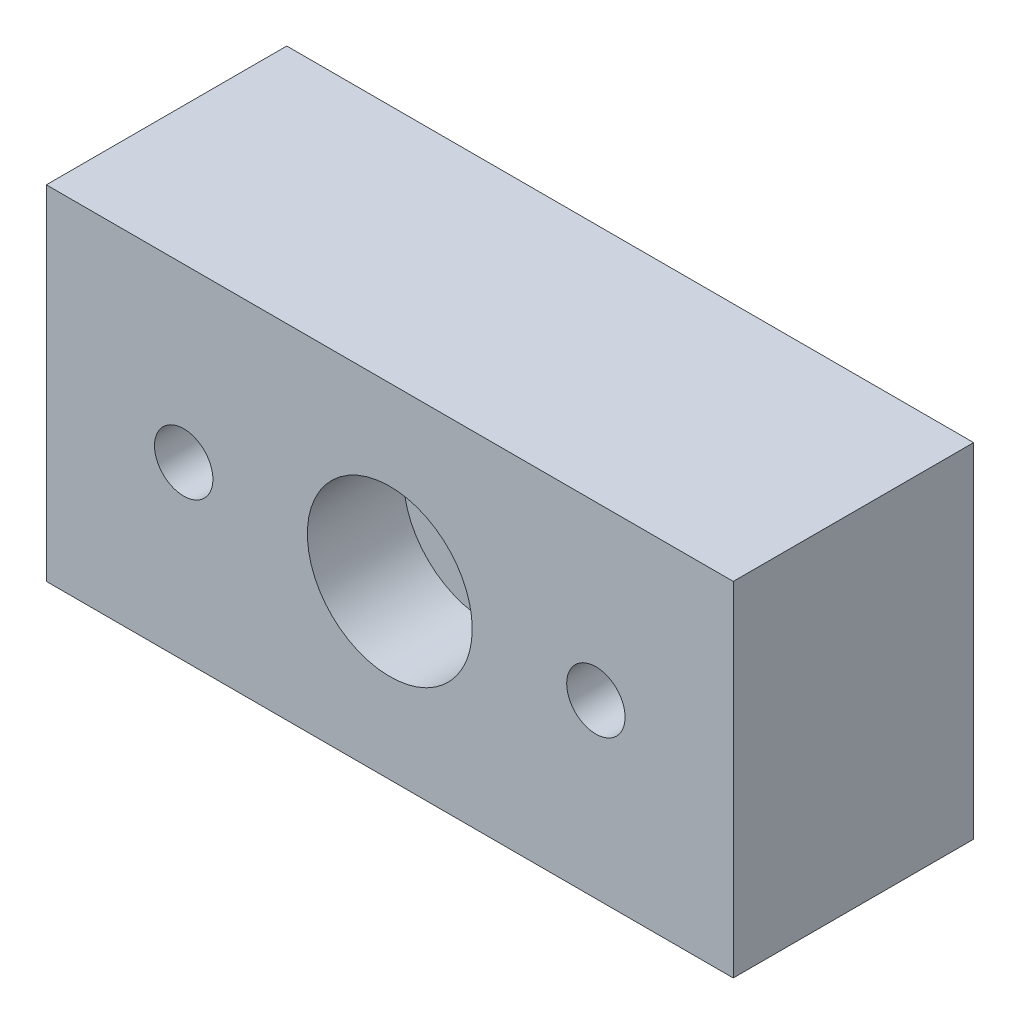
ISO-10303-21;
HEADER;
FILE_DESCRIPTION(('STEP AP214'),'2;1');
FILE_NAME('part.step','',(''),(''),'','','');
FILE_SCHEMA(('AUTOMOTIVE_DESIGN { 1 0 10303 214 1 1 1 1 }'));
ENDSEC;
DATA;
#1=APPLICATION_CONTEXT('core data for automotive mechanical design processes');
#2=APPLICATION_PROTOCOL_DEFINITION('international standard','automotive_design',2000,#1);
#3=PRODUCT_CONTEXT('',#1,'mechanical');
#4=PRODUCT('Part','Part','',(#3));
#5=PRODUCT_RELATED_PRODUCT_CATEGORY('part','',(#4));
#6=PRODUCT_DEFINITION_FORMATION('','',#4);
#7=PRODUCT_DEFINITION_CONTEXT('part definition',#1,'design');
#8=PRODUCT_DEFINITION('design','',#6,#7);
#9=PRODUCT_DEFINITION_SHAPE('','',#8);
#10=(LENGTH_UNIT() NAMED_UNIT(*) SI_UNIT(.MILLI.,.METRE.));
#11=(NAMED_UNIT(*) PLANE_ANGLE_UNIT() SI_UNIT($,.RADIAN.));
#12=(NAMED_UNIT(*) SI_UNIT($,.STERADIAN.) SOLID_ANGLE_UNIT());
#13=UNCERTAINTY_MEASURE_WITH_UNIT(LENGTH_MEASURE(1.E-05),#10,'distance_accuracy_value','');
#14=(GEOMETRIC_REPRESENTATION_CONTEXT(3) GLOBAL_UNCERTAINTY_ASSIGNED_CONTEXT((#13)) GLOBAL_UNIT_ASSIGNED_CONTEXT((#10,
#11,#12)) REPRESENTATION_CONTEXT('',''));
#15=CARTESIAN_POINT('',(0.,0.,0.));
#16=DIRECTION('',(0.,0.,1.));
#17=DIRECTION('',(1.,0.,0.));
#18=AXIS2_PLACEMENT_3D('',#15,#16,#17);
#19=CARTESIAN_POINT('',(50.,-25.,35.));
#20=DIRECTION('',(-1.,0.,0.));
#21=DIRECTION('',(0.,0.,1.));
#22=AXIS2_PLACEMENT_3D('',#19,#20,#21);
#23=PLANE('',#22);
#24=DIRECTION('',(0.,1.,0.));
#25=VECTOR('',#24,1.);
#26=CARTESIAN_POINT('',(50.,-25.,0.));
#27=LINE('',#26,#25);
#28=CARTESIAN_POINT('',(50.,-25.,0.));
#29=VERTEX_POINT('',#28);
#30=CARTESIAN_POINT('',(50.,25.,0.));
#31=VERTEX_POINT('',#30);
#32=EDGE_CURVE('E259',#29,#31,#27,.T.);
#33=ORIENTED_EDGE('',*,*,#32,.T.);
#34=DIRECTION('',(0.,0.,-1.));
#35=VECTOR('',#34,1.);
#36=CARTESIAN_POINT('',(50.,25.,35.));
#37=LINE('',#36,#35);
#38=CARTESIAN_POINT('',(50.,25.,35.));
#39=VERTEX_POINT('',#38);
#40=EDGE_CURVE('E11',#39,#31,#37,.T.);
#41=ORIENTED_EDGE('',*,*,#40,.F.);
#42=DIRECTION('',(0.,1.,0.));
#43=VECTOR('',#42,1.);
#44=CARTESIAN_POINT('',(50.,-25.,35.));
#45=LINE('',#44,#43);
#46=CARTESIAN_POINT('',(50.,-25.,35.));
#47=VERTEX_POINT('',#46);
#48=EDGE_CURVE('E260',#47,#39,#45,.T.);
#49=ORIENTED_EDGE('',*,*,#48,.F.);
#50=DIRECTION('',(0.,0.,-1.));
#51=VECTOR('',#50,1.);
#52=CARTESIAN_POINT('',(50.,-25.,35.));
#53=LINE('',#52,#51);
#54=EDGE_CURVE('E270',#47,#29,#53,.T.);
#55=ORIENTED_EDGE('',*,*,#54,.T.);
#56=EDGE_LOOP('',(#33,#41,#49,#55));
#57=FACE_BOUND('',#56,.T.);
#58=ADVANCED_FACE('F43',(#57),#23,.F.);
#59=CARTESIAN_POINT('',(-50.,25.,35.));
#60=DIRECTION('',(0.,-1.,0.));
#61=DIRECTION('',(0.,0.,-1.));
#62=AXIS2_PLACEMENT_3D('',#59,#60,#61);
#63=PLANE('',#62);
#64=DIRECTION('',(-1.,0.,0.));
#65=VECTOR('',#64,1.);
#66=CARTESIAN_POINT('',(-50.,25.,0.));
#67=LINE('',#66,#65);
#68=CARTESIAN_POINT('',(-50.,25.,0.));
#69=VERTEX_POINT('',#68);
#70=EDGE_CURVE('E274',#31,#69,#67,.T.);
#71=ORIENTED_EDGE('',*,*,#70,.T.);
#72=DIRECTION('',(0.,0.,-1.));
#73=VECTOR('',#72,1.);
#74=CARTESIAN_POINT('',(-50.,25.,35.));
#75=LINE('',#74,#73);
#76=CARTESIAN_POINT('',(-50.,25.,35.));
#77=VERTEX_POINT('',#76);
#78=EDGE_CURVE('E53',#77,#69,#75,.T.);
#79=ORIENTED_EDGE('',*,*,#78,.F.);
#80=DIRECTION('',(-1.,0.,0.));
#81=VECTOR('',#80,1.);
#82=CARTESIAN_POINT('',(-50.,25.,35.));
#83=LINE('',#82,#81);
#84=EDGE_CURVE('E93',#39,#77,#83,.T.);
#85=ORIENTED_EDGE('',*,*,#84,.F.);
#86=ORIENTED_EDGE('',*,*,#40,.T.);
#87=EDGE_LOOP('',(#71,#79,#85,#86));
#88=FACE_BOUND('',#87,.T.);
#89=ADVANCED_FACE('F312',(#88),#63,.F.);
#90=CARTESIAN_POINT('',(-50.,-25.,35.));
#91=DIRECTION('',(1.,0.,0.));
#92=DIRECTION('',(0.,0.,-1.));
#93=AXIS2_PLACEMENT_3D('',#90,#91,#92);
#94=PLANE('',#93);
#95=DIRECTION('',(0.,-1.,0.));
#96=VECTOR('',#95,1.);
#97=CARTESIAN_POINT('',(-50.,-25.,0.));
#98=LINE('',#97,#96);
#99=CARTESIAN_POINT('',(-50.,-25.,0.));
#100=VERTEX_POINT('',#99);
#101=EDGE_CURVE('E80',#69,#100,#98,.T.);
#102=ORIENTED_EDGE('',*,*,#101,.T.);
#103=DIRECTION('',(0.,0.,-1.));
#104=VECTOR('',#103,1.);
#105=CARTESIAN_POINT('',(-50.,-25.,35.));
#106=LINE('',#105,#104);
#107=CARTESIAN_POINT('',(-50.,-25.,35.));
#108=VERTEX_POINT('',#107);
#109=EDGE_CURVE('E283',#108,#100,#106,.T.);
#110=ORIENTED_EDGE('',*,*,#109,.F.);
#111=DIRECTION('',(0.,-1.,0.));
#112=VECTOR('',#111,1.);
#113=CARTESIAN_POINT('',(-50.,-25.,35.));
#114=LINE('',#113,#112);
#115=EDGE_CURVE('E265',#77,#108,#114,.T.);
#116=ORIENTED_EDGE('',*,*,#115,.F.);
#117=ORIENTED_EDGE('',*,*,#78,.T.);
#118=EDGE_LOOP('',(#102,#110,#116,#117));
#119=FACE_BOUND('',#118,.T.);
#120=ADVANCED_FACE('F317',(#119),#94,.F.);
#121=CARTESIAN_POINT('',(-50.,-25.,35.));
#122=DIRECTION('',(0.,1.,0.));
#123=DIRECTION('',(0.,0.,1.));
#124=AXIS2_PLACEMENT_3D('',#121,#122,#123);
#125=PLANE('',#124);
#126=DIRECTION('',(1.,0.,0.));
#127=VECTOR('',#126,1.);
#128=CARTESIAN_POINT('',(-50.,-25.,0.));
#129=LINE('',#128,#127);
#130=EDGE_CURVE('E86',#100,#29,#129,.T.);
#131=ORIENTED_EDGE('',*,*,#130,.T.);
#132=ORIENTED_EDGE('',*,*,#54,.F.);
#133=DIRECTION('',(1.,0.,0.));
#134=VECTOR('',#133,1.);
#135=CARTESIAN_POINT('',(-50.,-25.,35.));
#136=LINE('',#135,#134);
#137=EDGE_CURVE('E62',#108,#47,#136,.T.);
#138=ORIENTED_EDGE('',*,*,#137,.F.);
#139=ORIENTED_EDGE('',*,*,#109,.T.);
#140=EDGE_LOOP('',(#131,#132,#138,#139));
#141=FACE_BOUND('',#140,.T.);
#142=ADVANCED_FACE('F326',(#141),#125,.F.);
#143=CARTESIAN_POINT('',(0.,0.,35.));
#144=DIRECTION('',(0.,0.,-1.));
#145=DIRECTION('',(-1.,0.,0.));
#146=AXIS2_PLACEMENT_3D('',#143,#144,#145);
#147=PLANE('',#146);
#148=CARTESIAN_POINT('',(30.,0.,35.));
#149=DIRECTION('',(0.,0.,-1.));
#150=DIRECTION('',(-1.,0.,0.));
#151=AXIS2_PLACEMENT_3D('',#148,#149,#150);
#152=CIRCLE('',#151,4.25000000000001);
#153=CARTESIAN_POINT('',(25.75,0.,35.));
#154=VERTEX_POINT('',#153);
#155=EDGE_CURVE('E238',#154,#154,#152,.T.);
#156=ORIENTED_EDGE('',*,*,#155,.T.);
#157=EDGE_LOOP('',(#156));
#158=FACE_BOUND('',#157,.T.);
#159=CARTESIAN_POINT('',(-30.,0.,35.));
#160=DIRECTION('',(0.,0.,-1.));
#161=DIRECTION('',(-1.,0.,0.));
#162=AXIS2_PLACEMENT_3D('',#159,#160,#161);
#163=CIRCLE('',#162,4.25000000000001);
#164=CARTESIAN_POINT('',(-34.25,0.,35.));
#165=VERTEX_POINT('',#164);
#166=EDGE_CURVE('E242',#165,#165,#163,.T.);
#167=ORIENTED_EDGE('',*,*,#166,.T.);
#168=EDGE_LOOP('',(#167));
#169=FACE_BOUND('',#168,.T.);
#170=CARTESIAN_POINT('',(0.,0.,35.));
#171=DIRECTION('',(0.,0.,1.));
#172=DIRECTION('',(1.,0.,0.));
#173=AXIS2_PLACEMENT_3D('',#170,#171,#172);
#174=CIRCLE('',#173,12.);
#175=CARTESIAN_POINT('',(12.,0.,35.));
#176=VERTEX_POINT('',#175);
#177=EDGE_CURVE('E246',#176,#176,#174,.T.);
#178=ORIENTED_EDGE('',*,*,#177,.F.);
#179=EDGE_LOOP('',(#178));
#180=FACE_BOUND('',#179,.T.);
#181=ORIENTED_EDGE('',*,*,#48,.T.);
#182=ORIENTED_EDGE('',*,*,#84,.T.);
#183=ORIENTED_EDGE('',*,*,#115,.T.);
#184=ORIENTED_EDGE('',*,*,#137,.T.);
#185=EDGE_LOOP('',(#181,#182,#183,#184));
#186=FACE_BOUND('',#185,.T.);
#187=ADVANCED_FACE('F324',(#158,#169,#180,#186),#147,.F.);
#188=CARTESIAN_POINT('',(0.,0.,0.));
#189=DIRECTION('',(0.,0.,-1.));
#190=DIRECTION('',(-1.,0.,0.));
#191=AXIS2_PLACEMENT_3D('',#188,#189,#190);
#192=PLANE('',#191);
#193=CARTESIAN_POINT('',(-21.0770028615328,-8.02372245699631,0.));
#194=DIRECTION('',(0.,0.,-1.));
#195=DIRECTION('',(-1.,0.,0.));
#196=AXIS2_PLACEMENT_3D('',#193,#194,#195);
#197=CIRCLE('',#196,1.775);
#198=CARTESIAN_POINT('',(-22.8520028615328,-8.02372245699631,0.));
#199=VERTEX_POINT('',#198);
#200=EDGE_CURVE('E138',#199,#199,#197,.T.);
#201=ORIENTED_EDGE('',*,*,#200,.F.);
#202=EDGE_LOOP('',(#201));
#203=FACE_BOUND('',#202,.T.);
#204=CARTESIAN_POINT('',(-38.0237224569963,-8.92299713846712,0.));
#205=DIRECTION('',(0.,0.,-1.));
#206=DIRECTION('',(-1.,0.,0.));
#207=AXIS2_PLACEMENT_3D('',#204,#205,#206);
#208=CIRCLE('',#207,1.775);
#209=CARTESIAN_POINT('',(-39.7987224569963,-8.92299713846712,0.));
#210=VERTEX_POINT('',#209);
#211=EDGE_CURVE('E129',#210,#210,#208,.T.);
#212=ORIENTED_EDGE('',*,*,#211,.F.);
#213=EDGE_LOOP('',(#212));
#214=FACE_BOUND('',#213,.T.);
#215=CARTESIAN_POINT('',(-38.9229971384671,8.02372245699635,0.));
#216=DIRECTION('',(0.,0.,-1.));
#217=DIRECTION('',(-1.,0.,0.));
#218=AXIS2_PLACEMENT_3D('',#215,#216,#217);
#219=CIRCLE('',#218,1.775);
#220=CARTESIAN_POINT('',(-40.6979971384671,8.02372245699635,0.));
#221=VERTEX_POINT('',#220);
#222=EDGE_CURVE('E149',#221,#221,#219,.T.);
#223=ORIENTED_EDGE('',*,*,#222,.F.);
#224=EDGE_LOOP('',(#223));
#225=FACE_BOUND('',#224,.T.);
#226=CARTESIAN_POINT('',(-21.9762775430036,8.92299713846716,0.));
#227=DIRECTION('',(0.,0.,-1.));
#228=DIRECTION('',(-1.,0.,0.));
#229=AXIS2_PLACEMENT_3D('',#226,#227,#228);
#230=CIRCLE('',#229,1.775);
#231=CARTESIAN_POINT('',(-23.7512775430036,8.92299713846716,0.));
#232=VERTEX_POINT('',#231);
#233=EDGE_CURVE('E161',#232,#232,#230,.T.);
#234=ORIENTED_EDGE('',*,*,#233,.F.);
#235=EDGE_LOOP('',(#234));
#236=FACE_BOUND('',#235,.T.);
#237=CARTESIAN_POINT('',(21.0770028615328,-8.0237224569963,0.));
#238=DIRECTION('',(0.,0.,-1.));
#239=DIRECTION('',(-1.,0.,0.));
#240=AXIS2_PLACEMENT_3D('',#237,#238,#239);
#241=CIRCLE('',#240,1.775);
#242=CARTESIAN_POINT('',(19.3020028615328,-8.0237224569963,0.));
#243=VERTEX_POINT('',#242);
#244=EDGE_CURVE('E173',#243,#243,#241,.T.);
#245=ORIENTED_EDGE('',*,*,#244,.F.);
#246=EDGE_LOOP('',(#245));
#247=FACE_BOUND('',#246,.T.);
#248=CARTESIAN_POINT('',(38.0237224569963,-8.92299713846711,0.));
#249=DIRECTION('',(0.,0.,-1.));
#250=DIRECTION('',(-1.,0.,0.));
#251=AXIS2_PLACEMENT_3D('',#248,#249,#250);
#252=CIRCLE('',#251,1.775);
#253=CARTESIAN_POINT('',(36.2487224569963,-8.92299713846711,0.));
#254=VERTEX_POINT('',#253);
#255=EDGE_CURVE('E185',#254,#254,#252,.T.);
#256=ORIENTED_EDGE('',*,*,#255,.F.);
#257=EDGE_LOOP('',(#256));
#258=FACE_BOUND('',#257,.T.);
#259=CARTESIAN_POINT('',(38.9229971384671,8.02372245699636,0.));
#260=DIRECTION('',(0.,0.,-1.));
#261=DIRECTION('',(-1.,0.,0.));
#262=AXIS2_PLACEMENT_3D('',#259,#260,#261);
#263=CIRCLE('',#262,1.775);
#264=CARTESIAN_POINT('',(37.1479971384671,8.02372245699636,0.));
#265=VERTEX_POINT('',#264);
#266=EDGE_CURVE('E197',#265,#265,#263,.T.);
#267=ORIENTED_EDGE('',*,*,#266,.F.);
#268=EDGE_LOOP('',(#267));
#269=FACE_BOUND('',#268,.T.);
#270=CARTESIAN_POINT('',(21.9762775430036,8.92299713846717,0.));
#271=DIRECTION('',(0.,0.,-1.));
#272=DIRECTION('',(-1.,0.,0.));
#273=AXIS2_PLACEMENT_3D('',#270,#271,#272);
#274=CIRCLE('',#273,1.775);
#275=CARTESIAN_POINT('',(20.2012775430036,8.92299713846717,0.));
#276=VERTEX_POINT('',#275);
#277=EDGE_CURVE('E209',#276,#276,#274,.T.);
#278=ORIENTED_EDGE('',*,*,#277,.F.);
#279=EDGE_LOOP('',(#278));
#280=FACE_BOUND('',#279,.T.);
#281=CARTESIAN_POINT('',(-30.,0.,0.));
#282=DIRECTION('',(0.,0.,-1.));
#283=DIRECTION('',(-1.,0.,0.));
#284=AXIS2_PLACEMENT_3D('',#281,#282,#283);
#285=CIRCLE('',#284,8.00000000000001);
#286=CARTESIAN_POINT('',(-38.,0.,0.));
#287=VERTEX_POINT('',#286);
#288=EDGE_CURVE('E221',#287,#287,#285,.T.);
#289=ORIENTED_EDGE('',*,*,#288,.F.);
#290=EDGE_LOOP('',(#289));
#291=FACE_BOUND('',#290,.T.);
#292=CARTESIAN_POINT('',(30.,0.,0.));
#293=DIRECTION('',(0.,0.,-1.));
#294=DIRECTION('',(-1.,0.,0.));
#295=AXIS2_PLACEMENT_3D('',#292,#293,#294);
#296=CIRCLE('',#295,8.00000000000001);
#297=CARTESIAN_POINT('',(22.,0.,0.));
#298=VERTEX_POINT('',#297);
#299=EDGE_CURVE('E229',#298,#298,#296,.T.);
#300=ORIENTED_EDGE('',*,*,#299,.F.);
#301=EDGE_LOOP('',(#300));
#302=FACE_BOUND('',#301,.T.);
#303=CARTESIAN_POINT('',(0.,0.,0.));
#304=DIRECTION('',(0.,0.,1.));
#305=DIRECTION('',(1.,0.,0.));
#306=AXIS2_PLACEMENT_3D('',#303,#304,#305);
#307=CIRCLE('',#306,4.24999999999999);
#308=CARTESIAN_POINT('',(4.24999999999999,0.,0.));
#309=VERTEX_POINT('',#308);
#310=EDGE_CURVE('E255',#309,#309,#307,.T.);
#311=ORIENTED_EDGE('',*,*,#310,.T.);
#312=EDGE_LOOP('',(#311));
#313=FACE_BOUND('',#312,.T.);
#314=ORIENTED_EDGE('',*,*,#32,.F.);
#315=ORIENTED_EDGE('',*,*,#130,.F.);
#316=ORIENTED_EDGE('',*,*,#101,.F.);
#317=ORIENTED_EDGE('',*,*,#70,.F.);
#318=EDGE_LOOP('',(#314,#315,#316,#317));
#319=FACE_BOUND('',#318,.T.);
#320=ADVANCED_FACE('F322',(#203,#214,#225,#236,#247,#258,#269,#280,#291,#302,#313,#319),#192,.T.);
#321=CARTESIAN_POINT('',(0.,0.,35.));
#322=DIRECTION('',(0.,0.,1.));
#323=DIRECTION('',(1.,0.,0.));
#324=AXIS2_PLACEMENT_3D('',#321,#322,#323);
#325=CYLINDRICAL_SURFACE('',#324,4.24999999999999);
#326=CARTESIAN_POINT('',(0.,0.,21.));
#327=DIRECTION('',(0.,0.,-1.));
#328=DIRECTION('',(-1.,0.,0.));
#329=AXIS2_PLACEMENT_3D('',#326,#327,#328);
#330=CIRCLE('',#329,4.24999999999999);
#331=CARTESIAN_POINT('',(-4.24999999999999,0.,21.));
#332=VERTEX_POINT('',#331);
#333=EDGE_CURVE('E254',#332,#332,#330,.F.);
#334=ORIENTED_EDGE('',*,*,#333,.T.);
#335=EDGE_LOOP('',(#334));
#336=FACE_BOUND('',#335,.T.);
#337=ORIENTED_EDGE('',*,*,#310,.F.);
#338=EDGE_LOOP('',(#337));
#339=FACE_BOUND('',#338,.T.);
#340=ADVANCED_FACE('F333',(#336,#339),#325,.F.);
#341=CARTESIAN_POINT('',(0.,0.,21.));
#342=DIRECTION('',(0.,0.,-1.));
#343=DIRECTION('',(-1.,0.,0.));
#344=AXIS2_PLACEMENT_3D('',#341,#342,#343);
#345=PLANE('',#344);
#346=CARTESIAN_POINT('',(0.,0.,21.));
#347=DIRECTION('',(0.,0.,1.));
#348=DIRECTION('',(1.,0.,0.));
#349=AXIS2_PLACEMENT_3D('',#346,#347,#348);
#350=CIRCLE('',#349,12.);
#351=CARTESIAN_POINT('',(12.,0.,21.));
#352=VERTEX_POINT('',#351);
#353=EDGE_CURVE('E250',#352,#352,#350,.T.);
#354=ORIENTED_EDGE('',*,*,#353,.T.);
#355=EDGE_LOOP('',(#354));
#356=FACE_BOUND('',#355,.T.);
#357=ORIENTED_EDGE('',*,*,#333,.F.);
#358=EDGE_LOOP('',(#357));
#359=FACE_BOUND('',#358,.T.);
#360=ADVANCED_FACE('F360',(#356,#359),#345,.F.);
#361=CARTESIAN_POINT('',(0.,0.,35.));
#362=DIRECTION('',(0.,0.,1.));
#363=DIRECTION('',(1.,0.,0.));
#364=AXIS2_PLACEMENT_3D('',#361,#362,#363);
#365=CYLINDRICAL_SURFACE('',#364,12.);
#366=ORIENTED_EDGE('',*,*,#353,.F.);
#367=EDGE_LOOP('',(#366));
#368=FACE_BOUND('',#367,.T.);
#369=ORIENTED_EDGE('',*,*,#177,.T.);
#370=EDGE_LOOP('',(#369));
#371=FACE_BOUND('',#370,.T.);
#372=ADVANCED_FACE('F370',(#368,#371),#365,.F.);
#373=CARTESIAN_POINT('',(-30.,0.,0.));
#374=DIRECTION('',(0.,0.,-1.));
#375=DIRECTION('',(-1.,0.,0.));
#376=AXIS2_PLACEMENT_3D('',#373,#374,#375);
#377=CYLINDRICAL_SURFACE('',#376,4.25000000000001);
#378=CARTESIAN_POINT('',(-30.,0.,20.));
#379=DIRECTION('',(0.,0.,1.));
#380=DIRECTION('',(1.,0.,0.));
#381=AXIS2_PLACEMENT_3D('',#378,#379,#380);
#382=CIRCLE('',#381,4.25000000000001);
#383=CARTESIAN_POINT('',(-25.75,0.,20.));
#384=VERTEX_POINT('',#383);
#385=EDGE_CURVE('E46',#384,#384,#382,.F.);
#386=ORIENTED_EDGE('',*,*,#385,.T.);
#387=EDGE_LOOP('',(#386));
#388=FACE_BOUND('',#387,.T.);
#389=ORIENTED_EDGE('',*,*,#166,.F.);
#390=EDGE_LOOP('',(#389));
#391=FACE_BOUND('',#390,.T.);
#392=ADVANCED_FACE('F309',(#388,#391),#377,.F.);
#393=CARTESIAN_POINT('',(30.,0.,0.));
#394=DIRECTION('',(0.,0.,-1.));
#395=DIRECTION('',(-1.,0.,0.));
#396=AXIS2_PLACEMENT_3D('',#393,#394,#395);
#397=CYLINDRICAL_SURFACE('',#396,4.25000000000001);
#398=CARTESIAN_POINT('',(30.,0.,20.));
#399=DIRECTION('',(0.,0.,1.));
#400=DIRECTION('',(1.,0.,0.));
#401=AXIS2_PLACEMENT_3D('',#398,#399,#400);
#402=CIRCLE('',#401,4.25000000000001);
#403=CARTESIAN_POINT('',(34.25,0.,20.));
#404=VERTEX_POINT('',#403);
#405=EDGE_CURVE('E237',#404,#404,#402,.F.);
#406=ORIENTED_EDGE('',*,*,#405,.T.);
#407=EDGE_LOOP('',(#406));
#408=FACE_BOUND('',#407,.T.);
#409=ORIENTED_EDGE('',*,*,#155,.F.);
#410=EDGE_LOOP('',(#409));
#411=FACE_BOUND('',#410,.T.);
#412=ADVANCED_FACE('F294',(#408,#411),#397,.F.);
#413=CARTESIAN_POINT('',(30.,0.,20.));
#414=DIRECTION('',(0.,0.,1.));
#415=DIRECTION('',(1.,0.,0.));
#416=AXIS2_PLACEMENT_3D('',#413,#414,#415);
#417=PLANE('',#416);
#418=CARTESIAN_POINT('',(30.,0.,20.));
#419=DIRECTION('',(0.,0.,-1.));
#420=DIRECTION('',(-1.,0.,0.));
#421=AXIS2_PLACEMENT_3D('',#418,#419,#420);
#422=CIRCLE('',#421,8.00000000000001);
#423=CARTESIAN_POINT('',(22.,0.,20.));
#424=VERTEX_POINT('',#423);
#425=EDGE_CURVE('E233',#424,#424,#422,.T.);
#426=ORIENTED_EDGE('',*,*,#425,.T.);
#427=EDGE_LOOP('',(#426));
#428=FACE_BOUND('',#427,.T.);
#429=ORIENTED_EDGE('',*,*,#405,.F.);
#430=EDGE_LOOP('',(#429));
#431=FACE_BOUND('',#430,.T.);
#432=ADVANCED_FACE('F297',(#428,#431),#417,.F.);
#433=CARTESIAN_POINT('',(30.,0.,0.));
#434=DIRECTION('',(0.,0.,-1.));
#435=DIRECTION('',(-1.,0.,0.));
#436=AXIS2_PLACEMENT_3D('',#433,#434,#435);
#437=CYLINDRICAL_SURFACE('',#436,8.00000000000001);
#438=ORIENTED_EDGE('',*,*,#425,.F.);
#439=EDGE_LOOP('',(#438));
#440=FACE_BOUND('',#439,.T.);
#441=ORIENTED_EDGE('',*,*,#299,.T.);
#442=EDGE_LOOP('',(#441));
#443=FACE_BOUND('',#442,.T.);
#444=ADVANCED_FACE('F299',(#440,#443),#437,.F.);
#445=CARTESIAN_POINT('',(-30.,0.,20.));
#446=DIRECTION('',(0.,0.,1.));
#447=DIRECTION('',(1.,0.,0.));
#448=AXIS2_PLACEMENT_3D('',#445,#446,#447);
#449=PLANE('',#448);
#450=CARTESIAN_POINT('',(-30.,0.,20.));
#451=DIRECTION('',(0.,0.,-1.));
#452=DIRECTION('',(-1.,0.,0.));
#453=AXIS2_PLACEMENT_3D('',#450,#451,#452);
#454=CIRCLE('',#453,8.00000000000001);
#455=CARTESIAN_POINT('',(-38.,0.,20.));
#456=VERTEX_POINT('',#455);
#457=EDGE_CURVE('E225',#456,#456,#454,.T.);
#458=ORIENTED_EDGE('',*,*,#457,.T.);
#459=EDGE_LOOP('',(#458));
#460=FACE_BOUND('',#459,.T.);
#461=ORIENTED_EDGE('',*,*,#385,.F.);
#462=EDGE_LOOP('',(#461));
#463=FACE_BOUND('',#462,.T.);
#464=ADVANCED_FACE('F306',(#460,#463),#449,.F.);
#465=CARTESIAN_POINT('',(-30.,0.,0.));
#466=DIRECTION('',(0.,0.,-1.));
#467=DIRECTION('',(-1.,0.,0.));
#468=AXIS2_PLACEMENT_3D('',#465,#466,#467);
#469=CYLINDRICAL_SURFACE('',#468,8.00000000000001);
#470=ORIENTED_EDGE('',*,*,#457,.F.);
#471=EDGE_LOOP('',(#470));
#472=FACE_BOUND('',#471,.T.);
#473=ORIENTED_EDGE('',*,*,#288,.T.);
#474=EDGE_LOOP('',(#473));
#475=FACE_BOUND('',#474,.T.);
#476=ADVANCED_FACE('F416',(#472,#475),#469,.F.);
#477=CARTESIAN_POINT('',(21.9762775430036,8.92299713846717,9.99999999999999));
#478=DIRECTION('',(0.,0.,-1.));
#479=DIRECTION('',(-1.,0.,0.));
#480=AXIS2_PLACEMENT_3D('',#477,#478,#479);
#481=CONICAL_SURFACE('',#480,1.44999999999999,1.02974425867665);
#482=CARTESIAN_POINT('',(21.9762775430036,8.92299713846717,10.87124789759));
#483=VERTEX_POINT('',#482);
#484=VERTEX_LOOP('',#483);
#485=FACE_BOUND('',#484,.T.);
#486=CARTESIAN_POINT('',(21.9762775430036,8.92299713846717,9.99999999999999));
#487=DIRECTION('',(0.,0.,-1.));
#488=DIRECTION('',(-1.,0.,0.));
#489=AXIS2_PLACEMENT_3D('',#486,#487,#488);
#490=CIRCLE('',#489,1.44999999999999);
#491=CARTESIAN_POINT('',(20.5262775430036,8.92299713846717,9.99999999999999));
#492=VERTEX_POINT('',#491);
#493=EDGE_CURVE('E217',#492,#492,#490,.T.);
#494=ORIENTED_EDGE('',*,*,#493,.T.);
#495=EDGE_LOOP('',(#494));
#496=FACE_BOUND('',#495,.T.);
#497=ADVANCED_FACE('F426',(#485,#496),#481,.F.);
#498=CARTESIAN_POINT('',(21.9762775430036,8.92299713846717,0.));
#499=DIRECTION('',(0.,0.,-1.));
#500=DIRECTION('',(-1.,0.,0.));
#501=AXIS2_PLACEMENT_3D('',#498,#499,#500);
#502=CYLINDRICAL_SURFACE('',#501,1.44999999999999);
#503=ORIENTED_EDGE('',*,*,#493,.F.);
#504=EDGE_LOOP('',(#503));
#505=FACE_BOUND('',#504,.T.);
#506=CARTESIAN_POINT('',(21.9762775430036,8.92299713846717,0.324999999999999));
#507=DIRECTION('',(0.,0.,-1.));
#508=DIRECTION('',(-1.,0.,0.));
#509=AXIS2_PLACEMENT_3D('',#506,#507,#508);
#510=CIRCLE('',#509,1.45);
#511=CARTESIAN_POINT('',(20.5262775430036,8.92299713846717,0.324999999999999));
#512=VERTEX_POINT('',#511);
#513=EDGE_CURVE('E213',#512,#512,#510,.T.);
#514=ORIENTED_EDGE('',*,*,#513,.T.);
#515=EDGE_LOOP('',(#514));
#516=FACE_BOUND('',#515,.T.);
#517=ADVANCED_FACE('F441',(#505,#516),#502,.F.);
#518=CARTESIAN_POINT('',(21.9762775430036,8.92299713846717,0.));
#519=DIRECTION('',(0.,0.,-1.));
#520=DIRECTION('',(-1.,0.,0.));
#521=AXIS2_PLACEMENT_3D('',#518,#519,#520);
#522=CONICAL_SURFACE('',#521,1.775,0.785398163397451);
#523=ORIENTED_EDGE('',*,*,#513,.F.);
#524=EDGE_LOOP('',(#523));
#525=FACE_BOUND('',#524,.T.);
#526=ORIENTED_EDGE('',*,*,#277,.T.);
#527=EDGE_LOOP('',(#526));
#528=FACE_BOUND('',#527,.T.);
#529=ADVANCED_FACE('F452',(#525,#528),#522,.F.);
#530=CARTESIAN_POINT('',(38.9229971384671,8.02372245699636,9.99999999999999));
#531=DIRECTION('',(0.,0.,-1.));
#532=DIRECTION('',(-1.,0.,0.));
#533=AXIS2_PLACEMENT_3D('',#530,#531,#532);
#534=CONICAL_SURFACE('',#533,1.44999999999999,1.02974425867665);
#535=CARTESIAN_POINT('',(38.9229971384671,8.02372245699636,10.87124789759));
#536=VERTEX_POINT('',#535);
#537=VERTEX_LOOP('',#536);
#538=FACE_BOUND('',#537,.T.);
#539=CARTESIAN_POINT('',(38.9229971384671,8.02372245699636,9.99999999999999));
#540=DIRECTION('',(0.,0.,-1.));
#541=DIRECTION('',(-1.,0.,0.));
#542=AXIS2_PLACEMENT_3D('',#539,#540,#541);
#543=CIRCLE('',#542,1.44999999999999);
#544=CARTESIAN_POINT('',(37.4729971384671,8.02372245699636,9.99999999999999));
#545=VERTEX_POINT('',#544);
#546=EDGE_CURVE('E205',#545,#545,#543,.T.);
#547=ORIENTED_EDGE('',*,*,#546,.T.);
#548=EDGE_LOOP('',(#547));
#549=FACE_BOUND('',#548,.T.);
#550=ADVANCED_FACE('F464',(#538,#549),#534,.F.);
#551=CARTESIAN_POINT('',(38.9229971384671,8.02372245699636,0.));
#552=DIRECTION('',(0.,0.,-1.));
#553=DIRECTION('',(-1.,0.,0.));
#554=AXIS2_PLACEMENT_3D('',#551,#552,#553);
#555=CYLINDRICAL_SURFACE('',#554,1.44999999999999);
#556=ORIENTED_EDGE('',*,*,#546,.F.);
#557=EDGE_LOOP('',(#556));
#558=FACE_BOUND('',#557,.T.);
#559=CARTESIAN_POINT('',(38.9229971384671,8.02372245699636,0.324999999999999));
#560=DIRECTION('',(0.,0.,-1.));
#561=DIRECTION('',(-1.,0.,0.));
#562=AXIS2_PLACEMENT_3D('',#559,#560,#561);
#563=CIRCLE('',#562,1.45);
#564=CARTESIAN_POINT('',(37.4729971384671,8.02372245699636,0.324999999999999));
#565=VERTEX_POINT('',#564);
#566=EDGE_CURVE('E201',#565,#565,#563,.T.);
#567=ORIENTED_EDGE('',*,*,#566,.T.);
#568=EDGE_LOOP('',(#567));
#569=FACE_BOUND('',#568,.T.);
#570=ADVANCED_FACE('F474',(#558,#569),#555,.F.);
#571=CARTESIAN_POINT('',(38.9229971384671,8.02372245699636,0.));
#572=DIRECTION('',(0.,0.,-1.));
#573=DIRECTION('',(-1.,0.,0.));
#574=AXIS2_PLACEMENT_3D('',#571,#572,#573);
#575=CONICAL_SURFACE('',#574,1.775,0.785398163397446);
#576=ORIENTED_EDGE('',*,*,#566,.F.);
#577=EDGE_LOOP('',(#576));
#578=FACE_BOUND('',#577,.T.);
#579=ORIENTED_EDGE('',*,*,#266,.T.);
#580=EDGE_LOOP('',(#579));
#581=FACE_BOUND('',#580,.T.);
#582=ADVANCED_FACE('F484',(#578,#581),#575,.F.);
#583=CARTESIAN_POINT('',(38.0237224569963,-8.92299713846711,9.99999999999999));
#584=DIRECTION('',(0.,0.,-1.));
#585=DIRECTION('',(-1.,0.,0.));
#586=AXIS2_PLACEMENT_3D('',#583,#584,#585);
#587=CONICAL_SURFACE('',#586,1.44999999999999,1.02974425867665);
#588=CARTESIAN_POINT('',(38.0237224569963,-8.92299713846711,10.87124789759));
#589=VERTEX_POINT('',#588);
#590=VERTEX_LOOP('',#589);
#591=FACE_BOUND('',#590,.T.);
#592=CARTESIAN_POINT('',(38.0237224569963,-8.92299713846711,9.99999999999999));
#593=DIRECTION('',(0.,0.,-1.));
#594=DIRECTION('',(-1.,0.,0.));
#595=AXIS2_PLACEMENT_3D('',#592,#593,#594);
#596=CIRCLE('',#595,1.44999999999999);
#597=CARTESIAN_POINT('',(36.5737224569963,-8.92299713846711,9.99999999999999));
#598=VERTEX_POINT('',#597);
#599=EDGE_CURVE('E193',#598,#598,#596,.T.);
#600=ORIENTED_EDGE('',*,*,#599,.T.);
#601=EDGE_LOOP('',(#600));
#602=FACE_BOUND('',#601,.T.);
#603=ADVANCED_FACE('F496',(#591,#602),#587,.F.);
#604=CARTESIAN_POINT('',(38.0237224569963,-8.92299713846711,0.));
#605=DIRECTION('',(0.,0.,-1.));
#606=DIRECTION('',(-1.,0.,0.));
#607=AXIS2_PLACEMENT_3D('',#604,#605,#606);
#608=CYLINDRICAL_SURFACE('',#607,1.44999999999999);
#609=ORIENTED_EDGE('',*,*,#599,.F.);
#610=EDGE_LOOP('',(#609));
#611=FACE_BOUND('',#610,.T.);
#612=CARTESIAN_POINT('',(38.0237224569963,-8.92299713846711,0.324999999999999));
#613=DIRECTION('',(0.,0.,-1.));
#614=DIRECTION('',(-1.,0.,0.));
#615=AXIS2_PLACEMENT_3D('',#612,#613,#614);
#616=CIRCLE('',#615,1.45);
#617=CARTESIAN_POINT('',(36.5737224569963,-8.92299713846711,0.324999999999999));
#618=VERTEX_POINT('',#617);
#619=EDGE_CURVE('E189',#618,#618,#616,.T.);
#620=ORIENTED_EDGE('',*,*,#619,.T.);
#621=EDGE_LOOP('',(#620));
#622=FACE_BOUND('',#621,.T.);
#623=ADVANCED_FACE('F506',(#611,#622),#608,.F.);
#624=CARTESIAN_POINT('',(38.0237224569963,-8.92299713846711,0.));
#625=DIRECTION('',(0.,0.,-1.));
#626=DIRECTION('',(-1.,0.,0.));
#627=AXIS2_PLACEMENT_3D('',#624,#625,#626);
#628=CONICAL_SURFACE('',#627,1.775,0.785398163397446);
#629=ORIENTED_EDGE('',*,*,#619,.F.);
#630=EDGE_LOOP('',(#629));
#631=FACE_BOUND('',#630,.T.);
#632=ORIENTED_EDGE('',*,*,#255,.T.);
#633=EDGE_LOOP('',(#632));
#634=FACE_BOUND('',#633,.T.);
#635=ADVANCED_FACE('F516',(#631,#634),#628,.F.);
#636=CARTESIAN_POINT('',(21.0770028615328,-8.0237224569963,9.99999999999999));
#637=DIRECTION('',(0.,0.,-1.));
#638=DIRECTION('',(-1.,0.,0.));
#639=AXIS2_PLACEMENT_3D('',#636,#637,#638);
#640=CONICAL_SURFACE('',#639,1.44999999999999,1.02974425867665);
#641=CARTESIAN_POINT('',(21.0770028615328,-8.0237224569963,10.87124789759));
#642=VERTEX_POINT('',#641);
#643=VERTEX_LOOP('',#642);
#644=FACE_BOUND('',#643,.T.);
#645=CARTESIAN_POINT('',(21.0770028615328,-8.0237224569963,9.99999999999999));
#646=DIRECTION('',(0.,0.,-1.));
#647=DIRECTION('',(-1.,0.,0.));
#648=AXIS2_PLACEMENT_3D('',#645,#646,#647);
#649=CIRCLE('',#648,1.44999999999999);
#650=CARTESIAN_POINT('',(19.6270028615328,-8.0237224569963,9.99999999999999));
#651=VERTEX_POINT('',#650);
#652=EDGE_CURVE('E181',#651,#651,#649,.T.);
#653=ORIENTED_EDGE('',*,*,#652,.T.);
#654=EDGE_LOOP('',(#653));
#655=FACE_BOUND('',#654,.T.);
#656=ADVANCED_FACE('F528',(#644,#655),#640,.F.);
#657=CARTESIAN_POINT('',(21.0770028615328,-8.0237224569963,0.));
#658=DIRECTION('',(0.,0.,-1.));
#659=DIRECTION('',(-1.,0.,0.));
#660=AXIS2_PLACEMENT_3D('',#657,#658,#659);
#661=CYLINDRICAL_SURFACE('',#660,1.44999999999999);
#662=ORIENTED_EDGE('',*,*,#652,.F.);
#663=EDGE_LOOP('',(#662));
#664=FACE_BOUND('',#663,.T.);
#665=CARTESIAN_POINT('',(21.0770028615328,-8.0237224569963,0.324999999999999));
#666=DIRECTION('',(0.,0.,-1.));
#667=DIRECTION('',(-1.,0.,0.));
#668=AXIS2_PLACEMENT_3D('',#665,#666,#667);
#669=CIRCLE('',#668,1.45);
#670=CARTESIAN_POINT('',(19.6270028615328,-8.0237224569963,0.324999999999999));
#671=VERTEX_POINT('',#670);
#672=EDGE_CURVE('E177',#671,#671,#669,.T.);
#673=ORIENTED_EDGE('',*,*,#672,.T.);
#674=EDGE_LOOP('',(#673));
#675=FACE_BOUND('',#674,.T.);
#676=ADVANCED_FACE('F538',(#664,#675),#661,.F.);
#677=CARTESIAN_POINT('',(21.0770028615328,-8.0237224569963,0.));
#678=DIRECTION('',(0.,0.,-1.));
#679=DIRECTION('',(-1.,0.,0.));
#680=AXIS2_PLACEMENT_3D('',#677,#678,#679);
#681=CONICAL_SURFACE('',#680,1.775,0.785398163397446);
#682=ORIENTED_EDGE('',*,*,#672,.F.);
#683=EDGE_LOOP('',(#682));
#684=FACE_BOUND('',#683,.T.);
#685=ORIENTED_EDGE('',*,*,#244,.T.);
#686=EDGE_LOOP('',(#685));
#687=FACE_BOUND('',#686,.T.);
#688=ADVANCED_FACE('F548',(#684,#687),#681,.F.);
#689=CARTESIAN_POINT('',(-21.9762775430036,8.92299713846716,9.99999999999999));
#690=DIRECTION('',(0.,0.,-1.));
#691=DIRECTION('',(-1.,0.,0.));
#692=AXIS2_PLACEMENT_3D('',#689,#690,#691);
#693=CONICAL_SURFACE('',#692,1.44999999999999,1.02974425867665);
#694=CARTESIAN_POINT('',(-21.9762775430036,8.92299713846716,10.87124789759));
#695=VERTEX_POINT('',#694);
#696=VERTEX_LOOP('',#695);
#697=FACE_BOUND('',#696,.T.);
#698=CARTESIAN_POINT('',(-21.9762775430036,8.92299713846716,9.99999999999999));
#699=DIRECTION('',(0.,0.,-1.));
#700=DIRECTION('',(-1.,0.,0.));
#701=AXIS2_PLACEMENT_3D('',#698,#699,#700);
#702=CIRCLE('',#701,1.44999999999999);
#703=CARTESIAN_POINT('',(-23.4262775430036,8.92299713846716,9.99999999999999));
#704=VERTEX_POINT('',#703);
#705=EDGE_CURVE('E169',#704,#704,#702,.T.);
#706=ORIENTED_EDGE('',*,*,#705,.T.);
#707=EDGE_LOOP('',(#706));
#708=FACE_BOUND('',#707,.T.);
#709=ADVANCED_FACE('F560',(#697,#708),#693,.F.);
#710=CARTESIAN_POINT('',(-21.9762775430036,8.92299713846716,0.));
#711=DIRECTION('',(0.,0.,-1.));
#712=DIRECTION('',(-1.,0.,0.));
#713=AXIS2_PLACEMENT_3D('',#710,#711,#712);
#714=CYLINDRICAL_SURFACE('',#713,1.44999999999999);
#715=ORIENTED_EDGE('',*,*,#705,.F.);
#716=EDGE_LOOP('',(#715));
#717=FACE_BOUND('',#716,.T.);
#718=CARTESIAN_POINT('',(-21.9762775430036,8.92299713846716,0.324999999999999));
#719=DIRECTION('',(0.,0.,-1.));
#720=DIRECTION('',(-1.,0.,0.));
#721=AXIS2_PLACEMENT_3D('',#718,#719,#720);
#722=CIRCLE('',#721,1.45);
#723=CARTESIAN_POINT('',(-23.4262775430036,8.92299713846716,0.324999999999999));
#724=VERTEX_POINT('',#723);
#725=EDGE_CURVE('E165',#724,#724,#722,.T.);
#726=ORIENTED_EDGE('',*,*,#725,.T.);
#727=EDGE_LOOP('',(#726));
#728=FACE_BOUND('',#727,.T.);
#729=ADVANCED_FACE('F570',(#717,#728),#714,.F.);
#730=CARTESIAN_POINT('',(-21.9762775430036,8.92299713846716,0.));
#731=DIRECTION('',(0.,0.,-1.));
#732=DIRECTION('',(-1.,0.,0.));
#733=AXIS2_PLACEMENT_3D('',#730,#731,#732);
#734=CONICAL_SURFACE('',#733,1.775,0.785398163397446);
#735=ORIENTED_EDGE('',*,*,#725,.F.);
#736=EDGE_LOOP('',(#735));
#737=FACE_BOUND('',#736,.T.);
#738=ORIENTED_EDGE('',*,*,#233,.T.);
#739=EDGE_LOOP('',(#738));
#740=FACE_BOUND('',#739,.T.);
#741=ADVANCED_FACE('F580',(#737,#740),#734,.F.);
#742=CARTESIAN_POINT('',(-38.9229971384671,8.02372245699635,9.99999999999999));
#743=DIRECTION('',(0.,0.,-1.));
#744=DIRECTION('',(-1.,0.,0.));
#745=AXIS2_PLACEMENT_3D('',#742,#743,#744);
#746=CONICAL_SURFACE('',#745,1.44999999999999,1.02974425867665);
#747=CARTESIAN_POINT('',(-38.9229971384671,8.02372245699635,10.87124789759));
#748=VERTEX_POINT('',#747);
#749=VERTEX_LOOP('',#748);
#750=FACE_BOUND('',#749,.T.);
#751=CARTESIAN_POINT('',(-38.9229971384671,8.02372245699635,9.99999999999999));
#752=DIRECTION('',(0.,0.,-1.));
#753=DIRECTION('',(-1.,0.,0.));
#754=AXIS2_PLACEMENT_3D('',#751,#752,#753);
#755=CIRCLE('',#754,1.44999999999999);
#756=CARTESIAN_POINT('',(-40.3729971384671,8.02372245699635,9.99999999999999));
#757=VERTEX_POINT('',#756);
#758=EDGE_CURVE('E157',#757,#757,#755,.T.);
#759=ORIENTED_EDGE('',*,*,#758,.T.);
#760=EDGE_LOOP('',(#759));
#761=FACE_BOUND('',#760,.T.);
#762=ADVANCED_FACE('F592',(#750,#761),#746,.F.);
#763=CARTESIAN_POINT('',(-38.9229971384671,8.02372245699635,0.));
#764=DIRECTION('',(0.,0.,-1.));
#765=DIRECTION('',(-1.,0.,0.));
#766=AXIS2_PLACEMENT_3D('',#763,#764,#765);
#767=CYLINDRICAL_SURFACE('',#766,1.44999999999999);
#768=ORIENTED_EDGE('',*,*,#758,.F.);
#769=EDGE_LOOP('',(#768));
#770=FACE_BOUND('',#769,.T.);
#771=CARTESIAN_POINT('',(-38.9229971384671,8.02372245699635,0.324999999999999));
#772=DIRECTION('',(0.,0.,-1.));
#773=DIRECTION('',(-1.,0.,0.));
#774=AXIS2_PLACEMENT_3D('',#771,#772,#773);
#775=CIRCLE('',#774,1.45);
#776=CARTESIAN_POINT('',(-40.3729971384671,8.02372245699635,0.324999999999999));
#777=VERTEX_POINT('',#776);
#778=EDGE_CURVE('E153',#777,#777,#775,.T.);
#779=ORIENTED_EDGE('',*,*,#778,.T.);
#780=EDGE_LOOP('',(#779));
#781=FACE_BOUND('',#780,.T.);
#782=ADVANCED_FACE('F602',(#770,#781),#767,.F.);
#783=CARTESIAN_POINT('',(-38.9229971384671,8.02372245699635,0.));
#784=DIRECTION('',(0.,0.,-1.));
#785=DIRECTION('',(-1.,0.,0.));
#786=AXIS2_PLACEMENT_3D('',#783,#784,#785);
#787=CONICAL_SURFACE('',#786,1.775,0.785398163397446);
#788=ORIENTED_EDGE('',*,*,#778,.F.);
#789=EDGE_LOOP('',(#788));
#790=FACE_BOUND('',#789,.T.);
#791=ORIENTED_EDGE('',*,*,#222,.T.);
#792=EDGE_LOOP('',(#791));
#793=FACE_BOUND('',#792,.T.);
#794=ADVANCED_FACE('F612',(#790,#793),#787,.F.);
#795=CARTESIAN_POINT('',(-38.0237224569963,-8.92299713846712,9.99999999999999));
#796=DIRECTION('',(0.,0.,-1.));
#797=DIRECTION('',(-1.,0.,0.));
#798=AXIS2_PLACEMENT_3D('',#795,#796,#797);
#799=CONICAL_SURFACE('',#798,1.44999999999999,1.02974425867665);
#800=CARTESIAN_POINT('',(-38.0237224569963,-8.92299713846712,10.87124789759));
#801=VERTEX_POINT('',#800);
#802=VERTEX_LOOP('',#801);
#803=FACE_BOUND('',#802,.T.);
#804=CARTESIAN_POINT('',(-38.0237224569963,-8.92299713846712,9.99999999999999));
#805=DIRECTION('',(0.,0.,-1.));
#806=DIRECTION('',(-1.,0.,0.));
#807=AXIS2_PLACEMENT_3D('',#804,#805,#806);
#808=CIRCLE('',#807,1.44999999999999);
#809=CARTESIAN_POINT('',(-39.4737224569963,-8.92299713846712,9.99999999999999));
#810=VERTEX_POINT('',#809);
#811=EDGE_CURVE('E145',#810,#810,#808,.T.);
#812=ORIENTED_EDGE('',*,*,#811,.T.);
#813=EDGE_LOOP('',(#812));
#814=FACE_BOUND('',#813,.T.);
#815=ADVANCED_FACE('F624',(#803,#814),#799,.F.);
#816=CARTESIAN_POINT('',(-38.0237224569963,-8.92299713846712,0.));
#817=DIRECTION('',(0.,0.,-1.));
#818=DIRECTION('',(-1.,0.,0.));
#819=AXIS2_PLACEMENT_3D('',#816,#817,#818);
#820=CYLINDRICAL_SURFACE('',#819,1.44999999999999);
#821=ORIENTED_EDGE('',*,*,#811,.F.);
#822=EDGE_LOOP('',(#821));
#823=FACE_BOUND('',#822,.T.);
#824=CARTESIAN_POINT('',(-38.0237224569963,-8.92299713846712,0.324999999999999));
#825=DIRECTION('',(0.,0.,-1.));
#826=DIRECTION('',(-1.,0.,0.));
#827=AXIS2_PLACEMENT_3D('',#824,#825,#826);
#828=CIRCLE('',#827,1.45);
#829=CARTESIAN_POINT('',(-39.4737224569963,-8.92299713846712,0.324999999999999));
#830=VERTEX_POINT('',#829);
#831=EDGE_CURVE('E135',#830,#830,#828,.T.);
#832=ORIENTED_EDGE('',*,*,#831,.T.);
#833=EDGE_LOOP('',(#832));
#834=FACE_BOUND('',#833,.T.);
#835=ADVANCED_FACE('F634',(#823,#834),#820,.F.);
#836=CARTESIAN_POINT('',(-38.0237224569963,-8.92299713846712,0.));
#837=DIRECTION('',(0.,0.,-1.));
#838=DIRECTION('',(-1.,0.,0.));
#839=AXIS2_PLACEMENT_3D('',#836,#837,#838);
#840=CONICAL_SURFACE('',#839,1.775,0.785398163397446);
#841=ORIENTED_EDGE('',*,*,#831,.F.);
#842=EDGE_LOOP('',(#841));
#843=FACE_BOUND('',#842,.T.);
#844=ORIENTED_EDGE('',*,*,#211,.T.);
#845=EDGE_LOOP('',(#844));
#846=FACE_BOUND('',#845,.T.);
#847=ADVANCED_FACE('F122',(#843,#846),#840,.F.);
#848=CARTESIAN_POINT('',(-21.0770028615328,-8.02372245699631,9.99999999999999));
#849=DIRECTION('',(0.,0.,-1.));
#850=DIRECTION('',(-1.,0.,0.));
#851=AXIS2_PLACEMENT_3D('',#848,#849,#850);
#852=CONICAL_SURFACE('',#851,1.44999999999999,1.02974425867665);
#853=CARTESIAN_POINT('',(-21.0770028615328,-8.02372245699631,10.87124789759));
#854=VERTEX_POINT('',#853);
#855=VERTEX_LOOP('',#854);
#856=FACE_BOUND('',#855,.T.);
#857=CARTESIAN_POINT('',(-21.0770028615328,-8.02372245699631,9.99999999999999));
#858=DIRECTION('',(0.,0.,-1.));
#859=DIRECTION('',(-1.,0.,0.));
#860=AXIS2_PLACEMENT_3D('',#857,#858,#859);
#861=CIRCLE('',#860,1.44999999999999);
#862=CARTESIAN_POINT('',(-22.5270028615328,-8.02372245699631,9.99999999999999));
#863=VERTEX_POINT('',#862);
#864=EDGE_CURVE('E126',#863,#863,#861,.T.);
#865=ORIENTED_EDGE('',*,*,#864,.T.);
#866=EDGE_LOOP('',(#865));
#867=FACE_BOUND('',#866,.T.);
#868=ADVANCED_FACE('F118',(#856,#867),#852,.F.);
#869=CARTESIAN_POINT('',(-21.0770028615328,-8.02372245699631,0.));
#870=DIRECTION('',(0.,0.,-1.));
#871=DIRECTION('',(-1.,0.,0.));
#872=AXIS2_PLACEMENT_3D('',#869,#870,#871);
#873=CYLINDRICAL_SURFACE('',#872,1.44999999999999);
#874=ORIENTED_EDGE('',*,*,#864,.F.);
#875=EDGE_LOOP('',(#874));
#876=FACE_BOUND('',#875,.T.);
#877=CARTESIAN_POINT('',(-21.0770028615328,-8.02372245699631,0.324999999999999));
#878=DIRECTION('',(0.,0.,-1.));
#879=DIRECTION('',(-1.,0.,0.));
#880=AXIS2_PLACEMENT_3D('',#877,#878,#879);
#881=CIRCLE('',#880,1.45);
#882=CARTESIAN_POINT('',(-22.5270028615328,-8.02372245699631,0.324999999999999));
#883=VERTEX_POINT('',#882);
#884=EDGE_CURVE('E130',#883,#883,#881,.T.);
#885=ORIENTED_EDGE('',*,*,#884,.T.);
#886=EDGE_LOOP('',(#885));
#887=FACE_BOUND('',#886,.T.);
#888=ADVANCED_FACE('F121',(#876,#887),#873,.F.);
#889=CARTESIAN_POINT('',(-21.0770028615328,-8.02372245699631,0.));
#890=DIRECTION('',(0.,0.,-1.));
#891=DIRECTION('',(-1.,0.,0.));
#892=AXIS2_PLACEMENT_3D('',#889,#890,#891);
#893=CONICAL_SURFACE('',#892,1.775,0.785398163397446);
#894=ORIENTED_EDGE('',*,*,#884,.F.);
#895=EDGE_LOOP('',(#894));
#896=FACE_BOUND('',#895,.T.);
#897=ORIENTED_EDGE('',*,*,#200,.T.);
#898=EDGE_LOOP('',(#897));
#899=FACE_BOUND('',#898,.T.);
#900=ADVANCED_FACE('F670',(#896,#899),#893,.F.);
#901=CLOSED_SHELL('',(#58,#89,#120,#142,#187,#320,#340,#360,#372,#392,#412,#432,#444,#464,#476,
#497,#517,#529,#550,#570,#582,#603,#623,#635,#656,#676,#688,#709,#729,#741,#762,#782,#794,#815,
#835,#847,#868,#888,#900));
#902=MANIFOLD_SOLID_BREP('B2',#901);
#903=ADVANCED_BREP_SHAPE_REPRESENTATION('',(#18,#902),#14);
#904=SHAPE_DEFINITION_REPRESENTATION(#9,#903);
ENDSEC;
END-ISO-10303-21;
